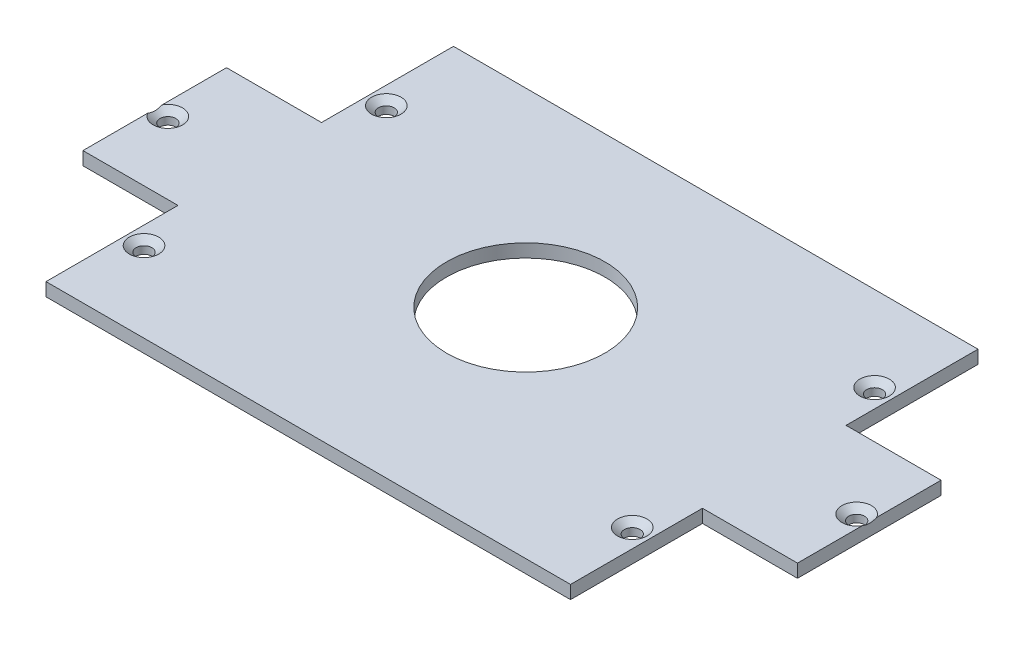
ISO-10303-21;
HEADER;
FILE_DESCRIPTION(('STEP AP214'),'2;1');
FILE_NAME('part.step','',(''),(''),'','','');
FILE_SCHEMA(('AUTOMOTIVE_DESIGN { 1 0 10303 214 1 1 1 1 }'));
ENDSEC;
DATA;
#1=APPLICATION_CONTEXT('core data for automotive mechanical design processes');
#2=APPLICATION_PROTOCOL_DEFINITION('international standard','automotive_design',2000,#1);
#3=PRODUCT_CONTEXT('',#1,'mechanical');
#4=PRODUCT('Part','Part','',(#3));
#5=PRODUCT_RELATED_PRODUCT_CATEGORY('part','',(#4));
#6=PRODUCT_DEFINITION_FORMATION('','',#4);
#7=PRODUCT_DEFINITION_CONTEXT('part definition',#1,'design');
#8=PRODUCT_DEFINITION('design','',#6,#7);
#9=PRODUCT_DEFINITION_SHAPE('','',#8);
#10=(LENGTH_UNIT() NAMED_UNIT(*) SI_UNIT(.MILLI.,.METRE.));
#11=(NAMED_UNIT(*) PLANE_ANGLE_UNIT() SI_UNIT($,.RADIAN.));
#12=(NAMED_UNIT(*) SI_UNIT($,.STERADIAN.) SOLID_ANGLE_UNIT());
#13=UNCERTAINTY_MEASURE_WITH_UNIT(LENGTH_MEASURE(1.E-05),#10,'distance_accuracy_value','');
#14=(GEOMETRIC_REPRESENTATION_CONTEXT(3) GLOBAL_UNCERTAINTY_ASSIGNED_CONTEXT((#13)) GLOBAL_UNIT_ASSIGNED_CONTEXT((#10,
#11,#12)) REPRESENTATION_CONTEXT('',''));
#15=CARTESIAN_POINT('',(0.,0.,0.));
#16=DIRECTION('',(0.,0.,1.));
#17=DIRECTION('',(1.,0.,0.));
#18=AXIS2_PLACEMENT_3D('',#15,#16,#17);
#19=CARTESIAN_POINT('',(0.,3.175,0.));
#20=DIRECTION('',(0.,-1.,0.));
#21=DIRECTION('',(0.,0.,-1.));
#22=AXIS2_PLACEMENT_3D('',#19,#20,#21);
#23=PLANE('',#22);
#24=CARTESIAN_POINT('',(-59.6133273346249,3.175,-37.2465531625836));
#25=DIRECTION('',(0.,1.,0.));
#26=DIRECTION('',(0.,0.,1.));
#27=AXIS2_PLACEMENT_3D('',#24,#25,#26);
#28=CIRCLE('',#27,3.5433);
#29=CARTESIAN_POINT('',(-59.6133273346249,3.175,-33.7032531625836));
#30=VERTEX_POINT('',#29);
#31=EDGE_CURVE('E364',#30,#30,#28,.T.);
#32=ORIENTED_EDGE('',*,*,#31,.F.);
#33=EDGE_LOOP('',(#32));
#34=FACE_BOUND('',#33,.T.);
#35=CARTESIAN_POINT('',(-59.6133273346249,3.175,21.0540531625834));
#36=DIRECTION('',(0.,1.,0.));
#37=DIRECTION('',(0.,0.,1.));
#38=AXIS2_PLACEMENT_3D('',#35,#36,#37);
#39=CIRCLE('',#38,3.5433);
#40=CARTESIAN_POINT('',(-59.6133273346249,3.175,24.5973531625834));
#41=VERTEX_POINT('',#40);
#42=EDGE_CURVE('E355',#41,#41,#39,.T.);
#43=ORIENTED_EDGE('',*,*,#42,.F.);
#44=EDGE_LOOP('',(#43));
#45=FACE_BOUND('',#44,.T.);
#46=CARTESIAN_POINT('',(57.8616726653751,3.175,21.0540531625834));
#47=DIRECTION('',(0.,1.,0.));
#48=DIRECTION('',(0.,0.,1.));
#49=AXIS2_PLACEMENT_3D('',#46,#47,#48);
#50=CIRCLE('',#49,3.5433);
#51=CARTESIAN_POINT('',(57.8616726653751,3.175,24.5973531625834));
#52=VERTEX_POINT('',#51);
#53=EDGE_CURVE('E346',#52,#52,#50,.T.);
#54=ORIENTED_EDGE('',*,*,#53,.F.);
#55=EDGE_LOOP('',(#54));
#56=FACE_BOUND('',#55,.T.);
#57=CARTESIAN_POINT('',(57.8616726653751,3.175,-37.2465531625836));
#58=DIRECTION('',(0.,1.,0.));
#59=DIRECTION('',(0.,0.,1.));
#60=AXIS2_PLACEMENT_3D('',#57,#58,#59);
#61=CIRCLE('',#60,3.5433);
#62=CARTESIAN_POINT('',(57.8616726653751,3.175,-33.7032531625836));
#63=VERTEX_POINT('',#62);
#64=EDGE_CURVE('E337',#63,#63,#61,.T.);
#65=ORIENTED_EDGE('',*,*,#64,.F.);
#66=EDGE_LOOP('',(#65));
#67=FACE_BOUND('',#66,.T.);
#68=DIRECTION('',(0.,0.,-1.));
#69=VECTOR('',#68,1.);
#70=CARTESIAN_POINT('',(85.166672665375,3.175,-25.9406776452774));
#71=LINE('',#70,#69);
#72=CARTESIAN_POINT('',(85.166672665375,3.175,8.60332235472264));
#73=VERTEX_POINT('',#72);
#74=CARTESIAN_POINT('',(85.166672665375,3.175,-7.00727762511277));
#75=VERTEX_POINT('',#74);
#76=EDGE_CURVE('E148',#73,#75,#71,.T.);
#77=ORIENTED_EDGE('',*,*,#76,.T.);
#78=CARTESIAN_POINT('',(82.071047665375,3.175,-8.73125000000011));
#79=DIRECTION('',(0.,1.,0.));
#80=DIRECTION('',(0.,0.,1.));
#81=AXIS2_PLACEMENT_3D('',#78,#79,#80);
#82=CIRCLE('',#81,3.5433);
#83=CARTESIAN_POINT('',(85.166672665375,3.175,-10.4552223748875));
#84=VERTEX_POINT('',#83);
#85=EDGE_CURVE('E56',#84,#75,#82,.T.);
#86=ORIENTED_EDGE('',*,*,#85,.F.);
#87=CARTESIAN_POINT('',(85.166672665375,3.175,-25.9406776452774));
#88=VERTEX_POINT('',#87);
#89=EDGE_CURVE('E146',#84,#88,#71,.T.);
#90=ORIENTED_EDGE('',*,*,#89,.T.);
#91=DIRECTION('',(-1.,0.,0.));
#92=VECTOR('',#91,1.);
#93=CARTESIAN_POINT('',(62.306672665375,3.175,-25.9406776452774));
#94=LINE('',#93,#92);
#95=CARTESIAN_POINT('',(62.306672665375,3.175,-25.9406776452774));
#96=VERTEX_POINT('',#95);
#97=EDGE_CURVE('E157',#88,#96,#94,.T.);
#98=ORIENTED_EDGE('',*,*,#97,.T.);
#99=DIRECTION('',(0.,0.,-1.));
#100=VECTOR('',#99,1.);
#101=CARTESIAN_POINT('',(62.306672665375,3.175,-57.6906776452773));
#102=LINE('',#101,#100);
#103=CARTESIAN_POINT('',(62.306672665375,3.175,-57.6906776452773));
#104=VERTEX_POINT('',#103);
#105=EDGE_CURVE('E163',#96,#104,#102,.T.);
#106=ORIENTED_EDGE('',*,*,#105,.T.);
#107=DIRECTION('',(-1.,0.,0.));
#108=VECTOR('',#107,1.);
#109=CARTESIAN_POINT('',(-63.899577334625,3.175,-57.6906776452773));
#110=LINE('',#109,#108);
#111=CARTESIAN_POINT('',(-63.899577334625,3.175,-57.6906776452773));
#112=VERTEX_POINT('',#111);
#113=EDGE_CURVE('E165',#104,#112,#110,.T.);
#114=ORIENTED_EDGE('',*,*,#113,.T.);
#115=DIRECTION('',(0.,0.,1.));
#116=VECTOR('',#115,1.);
#117=CARTESIAN_POINT('',(-63.899577334625,3.175,-57.6906776452773));
#118=LINE('',#117,#116);
#119=CARTESIAN_POINT('',(-63.8995773346249,3.175,-25.9406776452773));
#120=VERTEX_POINT('',#119);
#121=EDGE_CURVE('E167',#112,#120,#118,.T.);
#122=ORIENTED_EDGE('',*,*,#121,.T.);
#123=DIRECTION('',(-1.,0.,0.));
#124=VECTOR('',#123,1.);
#125=CARTESIAN_POINT('',(-63.8995773346249,3.175,-25.9406776452773));
#126=LINE('',#125,#124);
#127=CARTESIAN_POINT('',(-86.7595773346249,3.175,-25.9406776452773));
#128=VERTEX_POINT('',#127);
#129=EDGE_CURVE('E169',#120,#128,#126,.T.);
#130=ORIENTED_EDGE('',*,*,#129,.T.);
#131=DIRECTION('',(0.,0.,1.));
#132=VECTOR('',#131,1.);
#133=CARTESIAN_POINT('',(-86.7595773346249,3.175,8.60332235472266));
#134=LINE('',#133,#132);
#135=CARTESIAN_POINT('',(-86.7595773346249,3.175,-10.4552223748874));
#136=VERTEX_POINT('',#135);
#137=EDGE_CURVE('E172',#128,#136,#134,.T.);
#138=ORIENTED_EDGE('',*,*,#137,.T.);
#139=CARTESIAN_POINT('',(-83.6639523346249,3.175,-8.73125000000011));
#140=DIRECTION('',(0.,1.,0.));
#141=DIRECTION('',(0.,0.,1.));
#142=AXIS2_PLACEMENT_3D('',#139,#140,#141);
#143=CIRCLE('',#142,3.5433);
#144=CARTESIAN_POINT('',(-86.7595773346249,3.175,-7.00727762511279));
#145=VERTEX_POINT('',#144);
#146=EDGE_CURVE('E62',#145,#136,#143,.T.);
#147=ORIENTED_EDGE('',*,*,#146,.F.);
#148=CARTESIAN_POINT('',(-86.7595773346249,3.175,8.60332235472266));
#149=VERTEX_POINT('',#148);
#150=EDGE_CURVE('E171',#145,#149,#134,.T.);
#151=ORIENTED_EDGE('',*,*,#150,.T.);
#152=DIRECTION('',(1.,0.,0.));
#153=VECTOR('',#152,1.);
#154=CARTESIAN_POINT('',(-63.8995773346249,3.175,8.60332235472266));
#155=LINE('',#154,#153);
#156=CARTESIAN_POINT('',(-63.8995773346249,3.175,8.60332235472266));
#157=VERTEX_POINT('',#156);
#158=EDGE_CURVE('E175',#149,#157,#155,.T.);
#159=ORIENTED_EDGE('',*,*,#158,.T.);
#160=DIRECTION('',(0.,0.,1.));
#161=VECTOR('',#160,1.);
#162=CARTESIAN_POINT('',(-63.8995773346249,3.175,8.60332235472266));
#163=LINE('',#162,#161);
#164=CARTESIAN_POINT('',(-63.8995773346249,3.175,40.3533223547227));
#165=VERTEX_POINT('',#164);
#166=EDGE_CURVE('E177',#157,#165,#163,.T.);
#167=ORIENTED_EDGE('',*,*,#166,.T.);
#168=DIRECTION('',(1.,0.,0.));
#169=VECTOR('',#168,1.);
#170=CARTESIAN_POINT('',(62.306672665375,3.175,40.3533223547226));
#171=LINE('',#170,#169);
#172=CARTESIAN_POINT('',(62.306672665375,3.175,40.3533223547226));
#173=VERTEX_POINT('',#172);
#174=EDGE_CURVE('E179',#165,#173,#171,.T.);
#175=ORIENTED_EDGE('',*,*,#174,.T.);
#176=DIRECTION('',(0.,0.,-1.));
#177=VECTOR('',#176,1.);
#178=CARTESIAN_POINT('',(62.306672665375,3.175,8.60332235472264));
#179=LINE('',#178,#177);
#180=CARTESIAN_POINT('',(62.306672665375,3.175,8.60332235472264));
#181=VERTEX_POINT('',#180);
#182=EDGE_CURVE('E158',#173,#181,#179,.T.);
#183=ORIENTED_EDGE('',*,*,#182,.T.);
#184=DIRECTION('',(1.,0.,0.));
#185=VECTOR('',#184,1.);
#186=CARTESIAN_POINT('',(62.306672665375,3.175,8.60332235472264));
#187=LINE('',#186,#185);
#188=EDGE_CURVE('E155',#181,#73,#187,.T.);
#189=ORIENTED_EDGE('',*,*,#188,.T.);
#190=EDGE_LOOP('',(#77,#86,#90,#98,#106,#114,#122,#130,#138,#147,#151,#159,#167,#175,#183,#189));
#191=FACE_BOUND('',#190,.T.);
#192=CARTESIAN_POINT('',(-0.796452334624956,3.175,-11.9706776452773));
#193=DIRECTION('',(0.,1.,0.));
#194=DIRECTION('',(0.,0.,1.));
#195=AXIS2_PLACEMENT_3D('',#192,#193,#194);
#196=CIRCLE('',#195,19.05);
#197=CARTESIAN_POINT('',(-0.796452334624956,3.175,7.07932235472266));
#198=VERTEX_POINT('',#197);
#199=EDGE_CURVE('E186',#198,#198,#196,.T.);
#200=ORIENTED_EDGE('',*,*,#199,.F.);
#201=EDGE_LOOP('',(#200));
#202=FACE_BOUND('',#201,.T.);
#203=ADVANCED_FACE('F37',(#34,#45,#56,#67,#191,#202),#23,.F.);
#204=CARTESIAN_POINT('',(0.,0.,0.));
#205=DIRECTION('',(0.,-1.,0.));
#206=DIRECTION('',(0.,0.,-1.));
#207=AXIS2_PLACEMENT_3D('',#204,#205,#206);
#208=PLANE('',#207);
#209=CARTESIAN_POINT('',(82.071047665375,0.,-8.73125000000011));
#210=DIRECTION('',(0.,1.,0.));
#211=DIRECTION('',(0.,0.,1.));
#212=AXIS2_PLACEMENT_3D('',#209,#210,#211);
#213=CIRCLE('',#212,1.89865);
#214=CARTESIAN_POINT('',(82.071047665375,0.,-6.83260000000011));
#215=VERTEX_POINT('',#214);
#216=EDGE_CURVE('E374',#215,#215,#213,.T.);
#217=ORIENTED_EDGE('',*,*,#216,.T.);
#218=EDGE_LOOP('',(#217));
#219=FACE_BOUND('',#218,.T.);
#220=CARTESIAN_POINT('',(-83.6639523346249,0.,-8.73125000000011));
#221=DIRECTION('',(0.,1.,0.));
#222=DIRECTION('',(0.,0.,1.));
#223=AXIS2_PLACEMENT_3D('',#220,#221,#222);
#224=CIRCLE('',#223,1.89865);
#225=CARTESIAN_POINT('',(-83.6639523346249,0.,-6.83260000000011));
#226=VERTEX_POINT('',#225);
#227=EDGE_CURVE('E367',#226,#226,#224,.T.);
#228=ORIENTED_EDGE('',*,*,#227,.T.);
#229=EDGE_LOOP('',(#228));
#230=FACE_BOUND('',#229,.T.);
#231=CARTESIAN_POINT('',(-59.6133273346249,0.,-37.2465531625836));
#232=DIRECTION('',(0.,1.,0.));
#233=DIRECTION('',(0.,0.,1.));
#234=AXIS2_PLACEMENT_3D('',#231,#232,#233);
#235=CIRCLE('',#234,1.89865);
#236=CARTESIAN_POINT('',(-59.6133273346249,0.,-35.3479031625836));
#237=VERTEX_POINT('',#236);
#238=EDGE_CURVE('E358',#237,#237,#235,.T.);
#239=ORIENTED_EDGE('',*,*,#238,.T.);
#240=EDGE_LOOP('',(#239));
#241=FACE_BOUND('',#240,.T.);
#242=CARTESIAN_POINT('',(-59.6133273346249,0.,21.0540531625834));
#243=DIRECTION('',(0.,1.,0.));
#244=DIRECTION('',(0.,0.,1.));
#245=AXIS2_PLACEMENT_3D('',#242,#243,#244);
#246=CIRCLE('',#245,1.89865);
#247=CARTESIAN_POINT('',(-59.6133273346249,0.,22.9527031625834));
#248=VERTEX_POINT('',#247);
#249=EDGE_CURVE('E349',#248,#248,#246,.T.);
#250=ORIENTED_EDGE('',*,*,#249,.T.);
#251=EDGE_LOOP('',(#250));
#252=FACE_BOUND('',#251,.T.);
#253=CARTESIAN_POINT('',(57.8616726653751,0.,21.0540531625834));
#254=DIRECTION('',(0.,1.,0.));
#255=DIRECTION('',(0.,0.,1.));
#256=AXIS2_PLACEMENT_3D('',#253,#254,#255);
#257=CIRCLE('',#256,1.89865);
#258=CARTESIAN_POINT('',(57.8616726653751,0.,22.9527031625834));
#259=VERTEX_POINT('',#258);
#260=EDGE_CURVE('E340',#259,#259,#257,.T.);
#261=ORIENTED_EDGE('',*,*,#260,.T.);
#262=EDGE_LOOP('',(#261));
#263=FACE_BOUND('',#262,.T.);
#264=CARTESIAN_POINT('',(57.8616726653751,0.,-37.2465531625836));
#265=DIRECTION('',(0.,1.,0.));
#266=DIRECTION('',(0.,0.,1.));
#267=AXIS2_PLACEMENT_3D('',#264,#265,#266);
#268=CIRCLE('',#267,1.89865);
#269=CARTESIAN_POINT('',(57.8616726653751,0.,-35.3479031625836));
#270=VERTEX_POINT('',#269);
#271=EDGE_CURVE('E329',#270,#270,#268,.T.);
#272=ORIENTED_EDGE('',*,*,#271,.T.);
#273=EDGE_LOOP('',(#272));
#274=FACE_BOUND('',#273,.T.);
#275=DIRECTION('',(0.,0.,-1.));
#276=VECTOR('',#275,1.);
#277=CARTESIAN_POINT('',(62.306672665375,0.,8.60332235472264));
#278=LINE('',#277,#276);
#279=CARTESIAN_POINT('',(62.306672665375,0.,40.3533223547226));
#280=VERTEX_POINT('',#279);
#281=CARTESIAN_POINT('',(62.306672665375,0.,8.60332235472264));
#282=VERTEX_POINT('',#281);
#283=EDGE_CURVE('E182',#280,#282,#278,.T.);
#284=ORIENTED_EDGE('',*,*,#283,.F.);
#285=DIRECTION('',(1.,0.,0.));
#286=VECTOR('',#285,1.);
#287=CARTESIAN_POINT('',(62.306672665375,0.,40.3533223547226));
#288=LINE('',#287,#286);
#289=CARTESIAN_POINT('',(-63.8995773346249,0.,40.3533223547227));
#290=VERTEX_POINT('',#289);
#291=EDGE_CURVE('E206',#290,#280,#288,.T.);
#292=ORIENTED_EDGE('',*,*,#291,.F.);
#293=DIRECTION('',(0.,0.,1.));
#294=VECTOR('',#293,1.);
#295=CARTESIAN_POINT('',(-63.8995773346249,0.,8.60332235472266));
#296=LINE('',#295,#294);
#297=CARTESIAN_POINT('',(-63.8995773346249,0.,8.60332235472266));
#298=VERTEX_POINT('',#297);
#299=EDGE_CURVE('E204',#298,#290,#296,.T.);
#300=ORIENTED_EDGE('',*,*,#299,.F.);
#301=DIRECTION('',(1.,0.,0.));
#302=VECTOR('',#301,1.);
#303=CARTESIAN_POINT('',(-63.8995773346249,0.,8.60332235472266));
#304=LINE('',#303,#302);
#305=CARTESIAN_POINT('',(-86.7595773346249,0.,8.60332235472266));
#306=VERTEX_POINT('',#305);
#307=EDGE_CURVE('E202',#306,#298,#304,.T.);
#308=ORIENTED_EDGE('',*,*,#307,.F.);
#309=DIRECTION('',(0.,0.,1.));
#310=VECTOR('',#309,1.);
#311=CARTESIAN_POINT('',(-86.7595773346249,0.,8.60332235472266));
#312=LINE('',#311,#310);
#313=CARTESIAN_POINT('',(-86.7595773346249,0.,-25.9406776452773));
#314=VERTEX_POINT('',#313);
#315=EDGE_CURVE('E200',#314,#306,#312,.T.);
#316=ORIENTED_EDGE('',*,*,#315,.F.);
#317=DIRECTION('',(-1.,0.,0.));
#318=VECTOR('',#317,1.);
#319=CARTESIAN_POINT('',(-63.8995773346249,0.,-25.9406776452773));
#320=LINE('',#319,#318);
#321=CARTESIAN_POINT('',(-63.8995773346249,0.,-25.9406776452773));
#322=VERTEX_POINT('',#321);
#323=EDGE_CURVE('E198',#322,#314,#320,.T.);
#324=ORIENTED_EDGE('',*,*,#323,.F.);
#325=DIRECTION('',(0.,0.,1.));
#326=VECTOR('',#325,1.);
#327=CARTESIAN_POINT('',(-63.899577334625,0.,-57.6906776452773));
#328=LINE('',#327,#326);
#329=CARTESIAN_POINT('',(-63.899577334625,0.,-57.6906776452773));
#330=VERTEX_POINT('',#329);
#331=EDGE_CURVE('E196',#330,#322,#328,.T.);
#332=ORIENTED_EDGE('',*,*,#331,.F.);
#333=DIRECTION('',(-1.,0.,0.));
#334=VECTOR('',#333,1.);
#335=CARTESIAN_POINT('',(-63.899577334625,0.,-57.6906776452773));
#336=LINE('',#335,#334);
#337=CARTESIAN_POINT('',(62.306672665375,0.,-57.6906776452773));
#338=VERTEX_POINT('',#337);
#339=EDGE_CURVE('E194',#338,#330,#336,.T.);
#340=ORIENTED_EDGE('',*,*,#339,.F.);
#341=DIRECTION('',(0.,0.,-1.));
#342=VECTOR('',#341,1.);
#343=CARTESIAN_POINT('',(62.306672665375,0.,-57.6906776452773));
#344=LINE('',#343,#342);
#345=CARTESIAN_POINT('',(62.306672665375,0.,-25.9406776452774));
#346=VERTEX_POINT('',#345);
#347=EDGE_CURVE('E192',#346,#338,#344,.T.);
#348=ORIENTED_EDGE('',*,*,#347,.F.);
#349=DIRECTION('',(-1.,0.,0.));
#350=VECTOR('',#349,1.);
#351=CARTESIAN_POINT('',(62.306672665375,0.,-25.9406776452774));
#352=LINE('',#351,#350);
#353=CARTESIAN_POINT('',(85.166672665375,0.,-25.9406776452774));
#354=VERTEX_POINT('',#353);
#355=EDGE_CURVE('E190',#354,#346,#352,.T.);
#356=ORIENTED_EDGE('',*,*,#355,.F.);
#357=DIRECTION('',(0.,0.,-1.));
#358=VECTOR('',#357,1.);
#359=CARTESIAN_POINT('',(85.166672665375,0.,-25.9406776452774));
#360=LINE('',#359,#358);
#361=CARTESIAN_POINT('',(85.166672665375,0.,8.60332235472264));
#362=VERTEX_POINT('',#361);
#363=EDGE_CURVE('E188',#362,#354,#360,.T.);
#364=ORIENTED_EDGE('',*,*,#363,.F.);
#365=DIRECTION('',(1.,0.,0.));
#366=VECTOR('',#365,1.);
#367=CARTESIAN_POINT('',(62.306672665375,0.,8.60332235472264));
#368=LINE('',#367,#366);
#369=EDGE_CURVE('E185',#282,#362,#368,.T.);
#370=ORIENTED_EDGE('',*,*,#369,.F.);
#371=EDGE_LOOP('',(#284,#292,#300,#308,#316,#324,#332,#340,#348,#356,#364,#370));
#372=FACE_BOUND('',#371,.T.);
#373=CARTESIAN_POINT('',(-0.796452334624956,0.,-11.9706776452773));
#374=DIRECTION('',(0.,1.,0.));
#375=DIRECTION('',(0.,0.,1.));
#376=AXIS2_PLACEMENT_3D('',#373,#374,#375);
#377=CIRCLE('',#376,19.05);
#378=CARTESIAN_POINT('',(-0.796452334624956,0.,7.07932235472266));
#379=VERTEX_POINT('',#378);
#380=EDGE_CURVE('E326',#379,#379,#377,.T.);
#381=ORIENTED_EDGE('',*,*,#380,.T.);
#382=EDGE_LOOP('',(#381));
#383=FACE_BOUND('',#382,.T.);
#384=ADVANCED_FACE('F284',(#219,#230,#241,#252,#263,#274,#372,#383),#208,.T.);
#385=CARTESIAN_POINT('',(62.306672665375,3.175,8.60332235472264));
#386=DIRECTION('',(-1.,0.,0.));
#387=DIRECTION('',(0.,0.,1.));
#388=AXIS2_PLACEMENT_3D('',#385,#386,#387);
#389=PLANE('',#388);
#390=ORIENTED_EDGE('',*,*,#283,.T.);
#391=DIRECTION('',(0.,-1.,0.));
#392=VECTOR('',#391,1.);
#393=CARTESIAN_POINT('',(62.306672665375,3.175,8.60332235472264));
#394=LINE('',#393,#392);
#395=EDGE_CURVE('E238',#181,#282,#394,.T.);
#396=ORIENTED_EDGE('',*,*,#395,.F.);
#397=ORIENTED_EDGE('',*,*,#182,.F.);
#398=DIRECTION('',(0.,-1.,0.));
#399=VECTOR('',#398,1.);
#400=CARTESIAN_POINT('',(62.306672665375,3.175,40.3533223547226));
#401=LINE('',#400,#399);
#402=EDGE_CURVE('E181',#173,#280,#401,.T.);
#403=ORIENTED_EDGE('',*,*,#402,.T.);
#404=EDGE_LOOP('',(#390,#396,#397,#403));
#405=FACE_BOUND('',#404,.T.);
#406=ADVANCED_FACE('F39',(#405),#389,.F.);
#407=CARTESIAN_POINT('',(62.306672665375,3.175,8.60332235472264));
#408=DIRECTION('',(0.,0.,-1.));
#409=DIRECTION('',(-1.,0.,0.));
#410=AXIS2_PLACEMENT_3D('',#407,#408,#409);
#411=PLANE('',#410);
#412=ORIENTED_EDGE('',*,*,#369,.T.);
#413=DIRECTION('',(0.,-1.,0.));
#414=VECTOR('',#413,1.);
#415=CARTESIAN_POINT('',(85.166672665375,3.175,8.60332235472264));
#416=LINE('',#415,#414);
#417=EDGE_CURVE('E235',#73,#362,#416,.T.);
#418=ORIENTED_EDGE('',*,*,#417,.F.);
#419=ORIENTED_EDGE('',*,*,#188,.F.);
#420=ORIENTED_EDGE('',*,*,#395,.T.);
#421=EDGE_LOOP('',(#412,#418,#419,#420));
#422=FACE_BOUND('',#421,.T.);
#423=ADVANCED_FACE('F278',(#422),#411,.F.);
#424=CARTESIAN_POINT('',(85.166672665375,3.175,-25.9406776452774));
#425=DIRECTION('',(-1.,0.,0.));
#426=DIRECTION('',(0.,0.,1.));
#427=AXIS2_PLACEMENT_3D('',#424,#425,#426);
#428=PLANE('',#427);
#429=ORIENTED_EDGE('',*,*,#89,.F.);
#430=CARTESIAN_POINT('',(85.166672665375,12.4441013809417,-22.9888419578755));
#431=CARTESIAN_POINT('',(85.166672665375,12.1344069225908,-22.6111374524505));
#432=CARTESIAN_POINT('',(85.166672665375,11.8250193551598,-22.2331804275082));
#433=CARTESIAN_POINT('',(85.166672665375,11.2064859423441,-21.4758258624886));
#434=CARTESIAN_POINT('',(85.166672665375,10.8973417759305,-21.0964269514799));
#435=CARTESIAN_POINT('',(85.166672665375,10.2686857273399,-20.3226347207685));
#436=CARTESIAN_POINT('',(85.166672665375,9.949215174756,-19.9282078013378));
#437=CARTESIAN_POINT('',(85.166672665375,9.31249995827895,-19.1388593118911));
#438=CARTESIAN_POINT('',(85.166672665375,8.99525212375669,-18.7439403017572));
#439=CARTESIAN_POINT('',(85.166672665375,8.40910125375085,-18.0100940583258));
#440=CARTESIAN_POINT('',(85.166672665375,8.13989919632548,-17.6714059185251));
#441=CARTESIAN_POINT('',(85.166672665375,7.60371614457835,-16.9922784999227));
#442=CARTESIAN_POINT('',(85.166672665375,7.33673513415723,-16.651839233843));
#443=CARTESIAN_POINT('',(85.166672665375,6.80382407288671,-15.9658232235261));
#444=CARTESIAN_POINT('',(85.166672665375,6.53791883270384,-15.6202271332418));
#445=CARTESIAN_POINT('',(85.166672665375,6.14276897651769,-15.0992217402923));
#446=CARTESIAN_POINT('',(85.166672665375,6.0117181573374,-14.9251829363721));
#447=CARTESIAN_POINT('',(85.166672665375,5.75113432517866,-14.575973706688));
#448=CARTESIAN_POINT('',(85.166672665375,5.62160129688307,-14.4008032923716));
#449=CARTESIAN_POINT('',(85.166672665375,5.36861351116803,-14.0547327676045));
#450=CARTESIAN_POINT('',(85.166672665375,5.24509756077272,-13.8838774634474));
#451=CARTESIAN_POINT('',(85.166672665375,5.00038053603806,-13.5405017635887));
#452=CARTESIAN_POINT('',(85.166672665375,4.87917956282986,-13.3679812956367));
#453=CARTESIAN_POINT('',(85.166672665375,4.63945435897496,-13.0202969842359));
#454=CARTESIAN_POINT('',(85.166672665375,4.52093955115432,-12.8451266225541));
#455=CARTESIAN_POINT('',(85.166672665375,4.28804916360398,-12.4920726630241));
#456=CARTESIAN_POINT('',(85.166672665375,4.17367306811354,-12.3141894072076));
#457=CARTESIAN_POINT('',(85.166672665375,3.95226790314328,-11.9575089010827));
#458=CARTESIAN_POINT('',(85.166672665375,3.84515537813969,-11.7787637877131));
#459=CARTESIAN_POINT('',(85.166672665375,3.63869604544494,-11.4166324324804));
#460=CARTESIAN_POINT('',(85.166672665375,3.53935426409936,-11.233243286579));
#461=CARTESIAN_POINT('',(85.166672665375,3.35258543283551,-10.8616793195566));
#462=CARTESIAN_POINT('',(85.166672665375,3.26509645393138,-10.6735359926622));
#463=CARTESIAN_POINT('',(85.166672665375,3.1068711810344,-10.2904013306374));
#464=CARTESIAN_POINT('',(85.166672665375,3.0361057059583,-10.0954226158903));
#465=CARTESIAN_POINT('',(85.166672665375,2.968857509656,-9.8679972621255));
#466=CARTESIAN_POINT('',(85.166672665375,2.96055678979797,-9.83898255526487));
#467=CARTESIAN_POINT('',(85.166672665375,2.94449215811897,-9.78079816054297));
#468=CARTESIAN_POINT('',(85.166672665375,2.93672835578111,-9.75162844237143));
#469=CARTESIAN_POINT('',(85.166672665375,2.91427494712465,-9.66387192915063));
#470=CARTESIAN_POINT('',(85.166672665375,2.90043161975613,-9.60506562057361));
#471=CARTESIAN_POINT('',(85.166672665375,2.87520444369178,-9.48694479695281));
#472=CARTESIAN_POINT('',(85.166672665375,2.86381987445963,-9.42763043610497));
#473=CARTESIAN_POINT('',(85.166672665375,2.84368729634553,-9.30855987310553));
#474=CARTESIAN_POINT('',(85.166672665375,2.83493901244329,-9.24880371770924));
#475=CARTESIAN_POINT('',(85.166672665375,2.82042753039214,-9.13054084086418));
#476=CARTESIAN_POINT('',(85.166672665375,2.81459110820736,-9.07204317372587));
#477=CARTESIAN_POINT('',(85.166672665375,2.80566166891058,-8.95484296844305));
#478=CARTESIAN_POINT('',(85.166672665375,2.80256864205944,-8.89614043102657));
#479=CARTESIAN_POINT('',(85.166672665375,2.7975088794536,-8.71984640248073));
#480=CARTESIAN_POINT('',(85.166672665375,2.79976579141101,-8.60210315534931));
#481=CARTESIAN_POINT('',(85.166672665375,2.81503486248295,-8.37273954884055));
#482=CARTESIAN_POINT('',(85.166672665375,2.82755274338696,-8.26108445750502));
#483=CARTESIAN_POINT('',(85.166672665375,2.8618901654608,-8.03926425648809));
#484=CARTESIAN_POINT('',(85.166672665375,2.8837074491308,-7.92909879188078));
#485=CARTESIAN_POINT('',(85.166672665375,2.93603211343008,-7.70827983970367));
#486=CARTESIAN_POINT('',(85.166672665375,2.96672231966729,-7.59767018803758));
#487=CARTESIAN_POINT('',(85.166672665375,3.01806661513988,-7.43345814957781));
#488=CARTESIAN_POINT('',(85.166672665375,3.03606644572271,-7.37900393492823));
#489=CARTESIAN_POINT('',(85.166672665375,3.07367274001274,-7.27065541094367));
#490=CARTESIAN_POINT('',(85.166672665375,3.09327912499906,-7.2167610743204));
#491=CARTESIAN_POINT('',(85.166672665375,3.15736710709347,-7.04773777047434));
#492=CARTESIAN_POINT('',(85.166672665375,3.20448106440411,-6.93360283507127));
#493=CARTESIAN_POINT('',(85.166672665375,3.30405005547473,-6.70767214143206));
#494=CARTESIAN_POINT('',(85.166672665375,3.35650694112979,-6.5958772105534));
#495=CARTESIAN_POINT('',(85.166672665375,3.46572549728184,-6.37423925464753));
#496=CARTESIAN_POINT('',(85.166672665375,3.52249270995121,-6.2643989746579));
#497=CARTESIAN_POINT('',(85.166672665375,3.63940997817159,-6.04656077972844));
#498=CARTESIAN_POINT('',(85.166672665375,3.69955965976789,-5.938562662839));
#499=CARTESIAN_POINT('',(85.166672665375,3.88485229505338,-5.61552568786059));
#500=CARTESIAN_POINT('',(85.166672665375,4.01412096151319,-5.40285673621412));
#501=CARTESIAN_POINT('',(85.166672665375,4.27976737429295,-4.98226598609358));
#502=CARTESIAN_POINT('',(85.166672665375,4.41614046359028,-4.77434120318701));
#503=CARTESIAN_POINT('',(85.166672665375,4.6782543604568,-4.38508141032023));
#504=CARTESIAN_POINT('',(85.166672665375,4.80346438060435,-4.20338755299008));
#505=CARTESIAN_POINT('',(85.166672665375,5.05683210985579,-3.84202616834274));
#506=CARTESIAN_POINT('',(85.166672665375,5.18499032977218,-3.66235900033513));
#507=CARTESIAN_POINT('',(85.166672665375,5.44176727976443,-3.30706400038243));
#508=CARTESIAN_POINT('',(85.166672665375,5.57035605439313,-3.13141446220855));
#509=CARTESIAN_POINT('',(85.166672665375,5.82920719274321,-2.78142563373584));
#510=CARTESIAN_POINT('',(85.166672665375,5.95946909230542,-2.60708600044237));
#511=CARTESIAN_POINT('',(85.166672665375,6.09036033939567,-2.43322689342186));
#512=B_SPLINE_CURVE_WITH_KNOTS('',3,(#430,#431,#432,#433,#434,#435,#436,#437,#438,#439,#440,
#441,#442,#443,#444,#445,#446,#447,#448,#449,#450,#451,#452,#453,#454,#455,#456,#457,#458,#459,
#460,#461,#462,#463,#464,#465,#466,#467,#468,#469,#470,#471,#472,#473,#474,#475,#476,#477,#478,
#479,#480,#481,#482,#483,#484,#485,#486,#487,#488,#489,#490,#491,#492,#493,#494,#495,#496,#497,
#498,#499,#500,#501,#502,#503,#504,#505,#506,#507,#508,#509,#510,#511),.UNSPECIFIED.,.F.,.F.,(4,
2,2,2,2,2,2,2,2,2,2,2,2,2,2,2,2,2,2,2,2,2,2,2,2,2,2,2,2,2,2,2,2,2,2,2,2,2,2,2,4),(0.,
1.46531385846888,2.93351646770488,4.45624338890572,5.97593009625948,7.27385020238527,
8.57176089226489,9.87988703821156,10.533466691093,11.1870397425332,11.8195039088595,
12.4519956418514,13.086440750023,13.7208065202873,14.3458200505891,14.9712345712577,
15.5932437929473,16.2141595128383,16.3046922195272,16.3952433326823,16.5764326531449,
16.7575688040155,16.9386860520085,17.1149848127413,17.2912829476051,17.6439835803441,
17.9806285440521,18.317191831171,18.6612555062975,18.8332912487484,19.005318566514,
19.3755567074389,19.7459236149445,20.116775074378,20.4875856139866,21.2339537519637,
21.9798386476791,22.6417762696732,23.3038294575555,23.9568806742279,24.6097544746858),.UNSPECIFIED.);
#513=EDGE_CURVE('E11',#84,#75,#512,.T.);
#514=ORIENTED_EDGE('',*,*,#513,.T.);
#515=ORIENTED_EDGE('',*,*,#76,.F.);
#516=ORIENTED_EDGE('',*,*,#417,.T.);
#517=ORIENTED_EDGE('',*,*,#363,.T.);
#518=DIRECTION('',(0.,-1.,0.));
#519=VECTOR('',#518,1.);
#520=CARTESIAN_POINT('',(85.166672665375,3.175,-25.9406776452774));
#521=LINE('',#520,#519);
#522=EDGE_CURVE('E153',#88,#354,#521,.T.);
#523=ORIENTED_EDGE('',*,*,#522,.F.);
#524=EDGE_LOOP('',(#429,#514,#515,#516,#517,#523));
#525=FACE_BOUND('',#524,.T.);
#526=ADVANCED_FACE('F151',(#525),#428,.F.);
#527=CARTESIAN_POINT('',(62.306672665375,3.175,-25.9406776452774));
#528=DIRECTION('',(0.,0.,1.));
#529=DIRECTION('',(1.,0.,0.));
#530=AXIS2_PLACEMENT_3D('',#527,#528,#529);
#531=PLANE('',#530);
#532=ORIENTED_EDGE('',*,*,#355,.T.);
#533=DIRECTION('',(0.,-1.,0.));
#534=VECTOR('',#533,1.);
#535=CARTESIAN_POINT('',(62.306672665375,3.175,-25.9406776452774));
#536=LINE('',#535,#534);
#537=EDGE_CURVE('E231',#96,#346,#536,.T.);
#538=ORIENTED_EDGE('',*,*,#537,.F.);
#539=ORIENTED_EDGE('',*,*,#97,.F.);
#540=ORIENTED_EDGE('',*,*,#522,.T.);
#541=EDGE_LOOP('',(#532,#538,#539,#540));
#542=FACE_BOUND('',#541,.T.);
#543=ADVANCED_FACE('F272',(#542),#531,.F.);
#544=CARTESIAN_POINT('',(62.306672665375,3.175,-57.6906776452773));
#545=DIRECTION('',(-1.,0.,0.));
#546=DIRECTION('',(0.,0.,1.));
#547=AXIS2_PLACEMENT_3D('',#544,#545,#546);
#548=PLANE('',#547);
#549=ORIENTED_EDGE('',*,*,#347,.T.);
#550=DIRECTION('',(0.,-1.,0.));
#551=VECTOR('',#550,1.);
#552=CARTESIAN_POINT('',(62.306672665375,3.175,-57.6906776452773));
#553=LINE('',#552,#551);
#554=EDGE_CURVE('E228',#104,#338,#553,.T.);
#555=ORIENTED_EDGE('',*,*,#554,.F.);
#556=ORIENTED_EDGE('',*,*,#105,.F.);
#557=ORIENTED_EDGE('',*,*,#537,.T.);
#558=EDGE_LOOP('',(#549,#555,#556,#557));
#559=FACE_BOUND('',#558,.T.);
#560=ADVANCED_FACE('F268',(#559),#548,.F.);
#561=CARTESIAN_POINT('',(-63.899577334625,3.175,-57.6906776452773));
#562=DIRECTION('',(0.,0.,1.));
#563=DIRECTION('',(1.,0.,0.));
#564=AXIS2_PLACEMENT_3D('',#561,#562,#563);
#565=PLANE('',#564);
#566=ORIENTED_EDGE('',*,*,#339,.T.);
#567=DIRECTION('',(0.,-1.,0.));
#568=VECTOR('',#567,1.);
#569=CARTESIAN_POINT('',(-63.899577334625,3.175,-57.6906776452773));
#570=LINE('',#569,#568);
#571=EDGE_CURVE('E225',#112,#330,#570,.T.);
#572=ORIENTED_EDGE('',*,*,#571,.F.);
#573=ORIENTED_EDGE('',*,*,#113,.F.);
#574=ORIENTED_EDGE('',*,*,#554,.T.);
#575=EDGE_LOOP('',(#566,#572,#573,#574));
#576=FACE_BOUND('',#575,.T.);
#577=ADVANCED_FACE('F264',(#576),#565,.F.);
#578=CARTESIAN_POINT('',(-63.899577334625,3.175,-57.6906776452773));
#579=DIRECTION('',(1.,0.,0.));
#580=DIRECTION('',(0.,0.,-1.));
#581=AXIS2_PLACEMENT_3D('',#578,#579,#580);
#582=PLANE('',#581);
#583=ORIENTED_EDGE('',*,*,#331,.T.);
#584=DIRECTION('',(0.,-1.,0.));
#585=VECTOR('',#584,1.);
#586=CARTESIAN_POINT('',(-63.8995773346249,3.175,-25.9406776452773));
#587=LINE('',#586,#585);
#588=EDGE_CURVE('E222',#120,#322,#587,.T.);
#589=ORIENTED_EDGE('',*,*,#588,.F.);
#590=ORIENTED_EDGE('',*,*,#121,.F.);
#591=ORIENTED_EDGE('',*,*,#571,.T.);
#592=EDGE_LOOP('',(#583,#589,#590,#591));
#593=FACE_BOUND('',#592,.T.);
#594=ADVANCED_FACE('F260',(#593),#582,.F.);
#595=CARTESIAN_POINT('',(-63.8995773346249,3.175,-25.9406776452773));
#596=DIRECTION('',(0.,0.,1.));
#597=DIRECTION('',(1.,0.,0.));
#598=AXIS2_PLACEMENT_3D('',#595,#596,#597);
#599=PLANE('',#598);
#600=ORIENTED_EDGE('',*,*,#323,.T.);
#601=DIRECTION('',(0.,-1.,0.));
#602=VECTOR('',#601,1.);
#603=CARTESIAN_POINT('',(-86.7595773346249,3.175,-25.9406776452773));
#604=LINE('',#603,#602);
#605=EDGE_CURVE('E219',#128,#314,#604,.T.);
#606=ORIENTED_EDGE('',*,*,#605,.F.);
#607=ORIENTED_EDGE('',*,*,#129,.F.);
#608=ORIENTED_EDGE('',*,*,#588,.T.);
#609=EDGE_LOOP('',(#600,#606,#607,#608));
#610=FACE_BOUND('',#609,.T.);
#611=ADVANCED_FACE('F255',(#610),#599,.F.);
#612=CARTESIAN_POINT('',(-86.7595773346249,3.175,8.60332235472266));
#613=DIRECTION('',(1.,0.,0.));
#614=DIRECTION('',(0.,0.,-1.));
#615=AXIS2_PLACEMENT_3D('',#612,#613,#614);
#616=PLANE('',#615);
#617=ORIENTED_EDGE('',*,*,#150,.F.);
#618=CARTESIAN_POINT('',(-86.7595773346249,12.4441013809417,-22.9888419578755));
#619=CARTESIAN_POINT('',(-86.7595773346249,12.1344069225908,-22.6111374524505));
#620=CARTESIAN_POINT('',(-86.7595773346249,11.8250193551598,-22.2331804275082));
#621=CARTESIAN_POINT('',(-86.7595773346249,11.2064859423441,-21.4758258624886));
#622=CARTESIAN_POINT('',(-86.7595773346249,10.8973417759305,-21.0964269514799));
#623=CARTESIAN_POINT('',(-86.7595773346249,10.2686857273399,-20.3226347207685));
#624=CARTESIAN_POINT('',(-86.7595773346249,9.94921517475601,-19.9282078013378));
#625=CARTESIAN_POINT('',(-86.7595773346249,9.31249995827896,-19.1388593118911));
#626=CARTESIAN_POINT('',(-86.7595773346249,8.9952521237567,-18.7439403017572));
#627=CARTESIAN_POINT('',(-86.7595773346249,8.40910125375086,-18.0100940583259));
#628=CARTESIAN_POINT('',(-86.7595773346249,8.13989919632549,-17.6714059185251));
#629=CARTESIAN_POINT('',(-86.7595773346249,7.60371614457836,-16.9922784999227));
#630=CARTESIAN_POINT('',(-86.7595773346249,7.33673513415724,-16.651839233843));
#631=CARTESIAN_POINT('',(-86.7595773346249,6.80382407288672,-15.9658232235261));
#632=CARTESIAN_POINT('',(-86.7595773346249,6.53791883270385,-15.6202271332418));
#633=CARTESIAN_POINT('',(-86.7595773346249,6.1427689765177,-15.0992217402923));
#634=CARTESIAN_POINT('',(-86.7595773346249,6.01171815733741,-14.9251829363721));
#635=CARTESIAN_POINT('',(-86.7595773346249,5.75113432517866,-14.575973706688));
#636=CARTESIAN_POINT('',(-86.7595773346249,5.62160129688307,-14.4008032923716));
#637=CARTESIAN_POINT('',(-86.7595773346249,5.36861351116804,-14.0547327676045));
#638=CARTESIAN_POINT('',(-86.7595773346249,5.24509756077273,-13.8838774634474));
#639=CARTESIAN_POINT('',(-86.7595773346249,5.00038053603807,-13.5405017635887));
#640=CARTESIAN_POINT('',(-86.7595773346249,4.87917956282987,-13.3679812956367));
#641=CARTESIAN_POINT('',(-86.7595773346249,4.63945435897497,-13.0202969842359));
#642=CARTESIAN_POINT('',(-86.7595773346249,4.52093955115433,-12.8451266225541));
#643=CARTESIAN_POINT('',(-86.7595773346249,4.28804916360399,-12.4920726630241));
#644=CARTESIAN_POINT('',(-86.7595773346249,4.17367306811355,-12.3141894072076));
#645=CARTESIAN_POINT('',(-86.7595773346249,3.95226790314329,-11.9575089010827));
#646=CARTESIAN_POINT('',(-86.7595773346249,3.8451553781397,-11.7787637877131));
#647=CARTESIAN_POINT('',(-86.7595773346249,3.63869604544496,-11.4166324324804));
#648=CARTESIAN_POINT('',(-86.7595773346249,3.53935426409937,-11.233243286579));
#649=CARTESIAN_POINT('',(-86.7595773346249,3.35258543283552,-10.8616793195566));
#650=CARTESIAN_POINT('',(-86.7595773346249,3.26509645393139,-10.6735359926622));
#651=CARTESIAN_POINT('',(-86.7595773346249,3.10687118103441,-10.2904013306374));
#652=CARTESIAN_POINT('',(-86.7595773346249,3.03610570595831,-10.0954226158903));
#653=CARTESIAN_POINT('',(-86.7595773346249,2.96885750965601,-9.8679972621255));
#654=CARTESIAN_POINT('',(-86.7595773346249,2.96055678979798,-9.83898255526487));
#655=CARTESIAN_POINT('',(-86.7595773346249,2.94449215811898,-9.78079816054297));
#656=CARTESIAN_POINT('',(-86.7595773346249,2.93672835578112,-9.75162844237144));
#657=CARTESIAN_POINT('',(-86.7595773346249,2.91427494712466,-9.66387192915063));
#658=CARTESIAN_POINT('',(-86.7595773346249,2.90043161975614,-9.6050656205736));
#659=CARTESIAN_POINT('',(-86.7595773346249,2.87520444369179,-9.48694479695281));
#660=CARTESIAN_POINT('',(-86.7595773346249,2.86381987445964,-9.42763043610497));
#661=CARTESIAN_POINT('',(-86.7595773346249,2.84368729634555,-9.30855987310552));
#662=CARTESIAN_POINT('',(-86.7595773346249,2.8349390124433,-9.24880371770924));
#663=CARTESIAN_POINT('',(-86.7595773346249,2.82042753039215,-9.13054084086418));
#664=CARTESIAN_POINT('',(-86.7595773346249,2.81459110820737,-9.07204317372587));
#665=CARTESIAN_POINT('',(-86.7595773346249,2.80566166891059,-8.95484296844304));
#666=CARTESIAN_POINT('',(-86.7595773346249,2.80256864205945,-8.89614043102656));
#667=CARTESIAN_POINT('',(-86.7595773346249,2.79750887945361,-8.71984640248073));
#668=CARTESIAN_POINT('',(-86.7595773346249,2.79976579141102,-8.6021031553493));
#669=CARTESIAN_POINT('',(-86.7595773346249,2.81503486248296,-8.37273954884055));
#670=CARTESIAN_POINT('',(-86.7595773346249,2.82755274338697,-8.26108445750501));
#671=CARTESIAN_POINT('',(-86.7595773346249,2.86189016546081,-8.03926425648808));
#672=CARTESIAN_POINT('',(-86.7595773346249,2.88370744913082,-7.92909879188077));
#673=CARTESIAN_POINT('',(-86.7595773346249,2.93603211343009,-7.70827983970366));
#674=CARTESIAN_POINT('',(-86.7595773346249,2.9667223196673,-7.59767018803757));
#675=CARTESIAN_POINT('',(-86.7595773346249,3.01806661513989,-7.4334581495778));
#676=CARTESIAN_POINT('',(-86.7595773346249,3.03606644572272,-7.37900393492823));
#677=CARTESIAN_POINT('',(-86.7595773346249,3.07367274001275,-7.27065541094366));
#678=CARTESIAN_POINT('',(-86.7595773346249,3.09327912499907,-7.21676107432039));
#679=CARTESIAN_POINT('',(-86.7595773346249,3.15736710709349,-7.04773777047433));
#680=CARTESIAN_POINT('',(-86.7595773346249,3.20448106440412,-6.93360283507125));
#681=CARTESIAN_POINT('',(-86.7595773346249,3.30405005547475,-6.70767214143205));
#682=CARTESIAN_POINT('',(-86.7595773346249,3.35650694112981,-6.59587721055338));
#683=CARTESIAN_POINT('',(-86.7595773346249,3.46572549728185,-6.37423925464752));
#684=CARTESIAN_POINT('',(-86.7595773346249,3.52249270995123,-6.26439897465788));
#685=CARTESIAN_POINT('',(-86.7595773346249,3.63940997817161,-6.04656077972843));
#686=CARTESIAN_POINT('',(-86.7595773346249,3.69955965976791,-5.93856266283898));
#687=CARTESIAN_POINT('',(-86.7595773346249,3.88485229505341,-5.61552568786057));
#688=CARTESIAN_POINT('',(-86.7595773346249,4.01412096151321,-5.40285673621409));
#689=CARTESIAN_POINT('',(-86.7595773346249,4.27976737429297,-4.98226598609356));
#690=CARTESIAN_POINT('',(-86.7595773346249,4.4161404635903,-4.77434120318699));
#691=CARTESIAN_POINT('',(-86.7595773346249,4.67825436045683,-4.3850814103202));
#692=CARTESIAN_POINT('',(-86.7595773346249,4.80346438060438,-4.20338755299006));
#693=CARTESIAN_POINT('',(-86.7595773346249,5.05683210985582,-3.8420261683427));
#694=CARTESIAN_POINT('',(-86.7595773346249,5.18499032977221,-3.6623590003351));
#695=CARTESIAN_POINT('',(-86.7595773346249,5.44176727976446,-3.30706400038239));
#696=CARTESIAN_POINT('',(-86.7595773346249,5.57035605439316,-3.13141446220851));
#697=CARTESIAN_POINT('',(-86.7595773346249,5.82920719274325,-2.7814256337358));
#698=CARTESIAN_POINT('',(-86.7595773346249,5.95946909230545,-2.60708600044233));
#699=CARTESIAN_POINT('',(-86.7595773346249,6.09036033939571,-2.43322689342182));
#700=B_SPLINE_CURVE_WITH_KNOTS('',3,(#618,#619,#620,#621,#622,#623,#624,#625,#626,#627,#628,
#629,#630,#631,#632,#633,#634,#635,#636,#637,#638,#639,#640,#641,#642,#643,#644,#645,#646,#647,
#648,#649,#650,#651,#652,#653,#654,#655,#656,#657,#658,#659,#660,#661,#662,#663,#664,#665,#666,
#667,#668,#669,#670,#671,#672,#673,#674,#675,#676,#677,#678,#679,#680,#681,#682,#683,#684,#685,
#686,#687,#688,#689,#690,#691,#692,#693,#694,#695,#696,#697,#698,#699),.UNSPECIFIED.,.F.,.F.,(4,
2,2,2,2,2,2,2,2,2,2,2,2,2,2,2,2,2,2,2,2,2,2,2,2,2,2,2,2,2,2,2,2,2,2,2,2,2,2,2,4),(0.,
1.46531385846888,2.93351646770488,4.45624338890571,5.97593009625947,7.27385020238526,
8.57176089226489,9.87988703821156,10.533466691093,11.1870397425332,11.8195039088595,
12.4519956418514,13.086440750023,13.7208065202873,14.3458200505891,14.9712345712577,
15.5932437929473,16.2141595128383,16.3046922195272,16.3952433326823,16.5764326531449,
16.7575688040155,16.9386860520085,17.1149848127413,17.2912829476051,17.6439835803441,
17.9806285440521,18.317191831171,18.6612555062975,18.8332912487484,19.005318566514,
19.3755567074389,19.7459236149446,20.1167750743781,20.4875856139867,21.2339537519637,
21.9798386476792,22.6417762696732,23.3038294575555,23.956880674228,24.6097544746858),.UNSPECIFIED.);
#701=EDGE_CURVE('E50',#145,#136,#700,.F.);
#702=ORIENTED_EDGE('',*,*,#701,.T.);
#703=ORIENTED_EDGE('',*,*,#137,.F.);
#704=ORIENTED_EDGE('',*,*,#605,.T.);
#705=ORIENTED_EDGE('',*,*,#315,.T.);
#706=DIRECTION('',(0.,-1.,0.));
#707=VECTOR('',#706,1.);
#708=CARTESIAN_POINT('',(-86.7595773346249,3.175,8.60332235472266));
#709=LINE('',#708,#707);
#710=EDGE_CURVE('E216',#149,#306,#709,.T.);
#711=ORIENTED_EDGE('',*,*,#710,.F.);
#712=EDGE_LOOP('',(#617,#702,#703,#704,#705,#711));
#713=FACE_BOUND('',#712,.T.);
#714=ADVANCED_FACE('F249',(#713),#616,.F.);
#715=CARTESIAN_POINT('',(-63.8995773346249,3.175,8.60332235472266));
#716=DIRECTION('',(0.,0.,-1.));
#717=DIRECTION('',(-1.,0.,0.));
#718=AXIS2_PLACEMENT_3D('',#715,#716,#717);
#719=PLANE('',#718);
#720=ORIENTED_EDGE('',*,*,#307,.T.);
#721=DIRECTION('',(0.,-1.,0.));
#722=VECTOR('',#721,1.);
#723=CARTESIAN_POINT('',(-63.8995773346249,3.175,8.60332235472266));
#724=LINE('',#723,#722);
#725=EDGE_CURVE('E213',#157,#298,#724,.T.);
#726=ORIENTED_EDGE('',*,*,#725,.F.);
#727=ORIENTED_EDGE('',*,*,#158,.F.);
#728=ORIENTED_EDGE('',*,*,#710,.T.);
#729=EDGE_LOOP('',(#720,#726,#727,#728));
#730=FACE_BOUND('',#729,.T.);
#731=ADVANCED_FACE('F254',(#730),#719,.F.);
#732=CARTESIAN_POINT('',(-63.8995773346249,3.175,8.60332235472266));
#733=DIRECTION('',(1.,0.,0.));
#734=DIRECTION('',(0.,0.,-1.));
#735=AXIS2_PLACEMENT_3D('',#732,#733,#734);
#736=PLANE('',#735);
#737=ORIENTED_EDGE('',*,*,#299,.T.);
#738=DIRECTION('',(0.,-1.,0.));
#739=VECTOR('',#738,1.);
#740=CARTESIAN_POINT('',(-63.8995773346249,3.175,40.3533223547227));
#741=LINE('',#740,#739);
#742=EDGE_CURVE('E210',#165,#290,#741,.T.);
#743=ORIENTED_EDGE('',*,*,#742,.F.);
#744=ORIENTED_EDGE('',*,*,#166,.F.);
#745=ORIENTED_EDGE('',*,*,#725,.T.);
#746=EDGE_LOOP('',(#737,#743,#744,#745));
#747=FACE_BOUND('',#746,.T.);
#748=ADVANCED_FACE('F302',(#747),#736,.F.);
#749=CARTESIAN_POINT('',(62.306672665375,3.175,40.3533223547226));
#750=DIRECTION('',(0.,0.,-1.));
#751=DIRECTION('',(-1.,0.,0.));
#752=AXIS2_PLACEMENT_3D('',#749,#750,#751);
#753=PLANE('',#752);
#754=ORIENTED_EDGE('',*,*,#291,.T.);
#755=ORIENTED_EDGE('',*,*,#402,.F.);
#756=ORIENTED_EDGE('',*,*,#174,.F.);
#757=ORIENTED_EDGE('',*,*,#742,.T.);
#758=EDGE_LOOP('',(#754,#755,#756,#757));
#759=FACE_BOUND('',#758,.T.);
#760=ADVANCED_FACE('F300',(#759),#753,.F.);
#761=CARTESIAN_POINT('',(-0.796452334624956,3.175,-11.9706776452773));
#762=DIRECTION('',(0.,-1.,0.));
#763=DIRECTION('',(0.,0.,-1.));
#764=AXIS2_PLACEMENT_3D('',#761,#762,#763);
#765=CYLINDRICAL_SURFACE('',#764,19.05);
#766=ORIENTED_EDGE('',*,*,#199,.T.);
#767=EDGE_LOOP('',(#766));
#768=FACE_BOUND('',#767,.T.);
#769=ORIENTED_EDGE('',*,*,#380,.F.);
#770=EDGE_LOOP('',(#769));
#771=FACE_BOUND('',#770,.T.);
#772=ADVANCED_FACE('F297',(#768,#771),#765,.F.);
#773=CARTESIAN_POINT('',(57.8616726653751,3.175,-37.2465531625836));
#774=DIRECTION('',(0.,1.,0.));
#775=DIRECTION('',(0.,0.,1.));
#776=AXIS2_PLACEMENT_3D('',#773,#774,#775);
#777=CYLINDRICAL_SURFACE('',#776,1.89865);
#778=ORIENTED_EDGE('',*,*,#271,.F.);
#779=EDGE_LOOP('',(#778));
#780=FACE_BOUND('',#779,.T.);
#781=CARTESIAN_POINT('',(57.8616726653751,1.79497479158429,-37.2465531625836));
#782=DIRECTION('',(0.,1.,0.));
#783=DIRECTION('',(0.,0.,1.));
#784=AXIS2_PLACEMENT_3D('',#781,#782,#783);
#785=CIRCLE('',#784,1.89865);
#786=CARTESIAN_POINT('',(57.8616726653751,1.79497479158429,-35.3479031625836));
#787=VERTEX_POINT('',#786);
#788=EDGE_CURVE('E334',#787,#787,#785,.T.);
#789=ORIENTED_EDGE('',*,*,#788,.T.);
#790=EDGE_LOOP('',(#789));
#791=FACE_BOUND('',#790,.T.);
#792=ADVANCED_FACE('F424',(#780,#791),#777,.F.);
#793=CARTESIAN_POINT('',(57.8616726653751,3.175,-37.2465531625836));
#794=DIRECTION('',(0.,1.,0.));
#795=DIRECTION('',(0.,0.,1.));
#796=AXIS2_PLACEMENT_3D('',#793,#794,#795);
#797=CONICAL_SURFACE('',#796,3.5433,0.872664625997165);
#798=ORIENTED_EDGE('',*,*,#788,.F.);
#799=EDGE_LOOP('',(#798));
#800=FACE_BOUND('',#799,.T.);
#801=ORIENTED_EDGE('',*,*,#64,.T.);
#802=EDGE_LOOP('',(#801));
#803=FACE_BOUND('',#802,.T.);
#804=ADVANCED_FACE('F421',(#800,#803),#797,.F.);
#805=CARTESIAN_POINT('',(57.8616726653751,3.175,21.0540531625834));
#806=DIRECTION('',(0.,1.,0.));
#807=DIRECTION('',(0.,0.,1.));
#808=AXIS2_PLACEMENT_3D('',#805,#806,#807);
#809=CYLINDRICAL_SURFACE('',#808,1.89865);
#810=ORIENTED_EDGE('',*,*,#260,.F.);
#811=EDGE_LOOP('',(#810));
#812=FACE_BOUND('',#811,.T.);
#813=CARTESIAN_POINT('',(57.8616726653751,1.79497479158429,21.0540531625834));
#814=DIRECTION('',(0.,1.,0.));
#815=DIRECTION('',(0.,0.,1.));
#816=AXIS2_PLACEMENT_3D('',#813,#814,#815);
#817=CIRCLE('',#816,1.89865);
#818=CARTESIAN_POINT('',(57.8616726653751,1.79497479158429,22.9527031625834));
#819=VERTEX_POINT('',#818);
#820=EDGE_CURVE('E343',#819,#819,#817,.T.);
#821=ORIENTED_EDGE('',*,*,#820,.T.);
#822=EDGE_LOOP('',(#821));
#823=FACE_BOUND('',#822,.T.);
#824=ADVANCED_FACE('F417',(#812,#823),#809,.F.);
#825=CARTESIAN_POINT('',(57.8616726653751,3.175,21.0540531625834));
#826=DIRECTION('',(0.,1.,0.));
#827=DIRECTION('',(0.,0.,1.));
#828=AXIS2_PLACEMENT_3D('',#825,#826,#827);
#829=CONICAL_SURFACE('',#828,3.5433,0.872664625997165);
#830=ORIENTED_EDGE('',*,*,#820,.F.);
#831=EDGE_LOOP('',(#830));
#832=FACE_BOUND('',#831,.T.);
#833=ORIENTED_EDGE('',*,*,#53,.T.);
#834=EDGE_LOOP('',(#833));
#835=FACE_BOUND('',#834,.T.);
#836=ADVANCED_FACE('F413',(#832,#835),#829,.F.);
#837=CARTESIAN_POINT('',(-59.6133273346249,3.175,21.0540531625834));
#838=DIRECTION('',(0.,1.,0.));
#839=DIRECTION('',(0.,0.,1.));
#840=AXIS2_PLACEMENT_3D('',#837,#838,#839);
#841=CYLINDRICAL_SURFACE('',#840,1.89865);
#842=ORIENTED_EDGE('',*,*,#249,.F.);
#843=EDGE_LOOP('',(#842));
#844=FACE_BOUND('',#843,.T.);
#845=CARTESIAN_POINT('',(-59.6133273346249,1.79497479158429,21.0540531625834));
#846=DIRECTION('',(0.,1.,0.));
#847=DIRECTION('',(0.,0.,1.));
#848=AXIS2_PLACEMENT_3D('',#845,#846,#847);
#849=CIRCLE('',#848,1.89865);
#850=CARTESIAN_POINT('',(-59.6133273346249,1.79497479158429,22.9527031625834));
#851=VERTEX_POINT('',#850);
#852=EDGE_CURVE('E352',#851,#851,#849,.T.);
#853=ORIENTED_EDGE('',*,*,#852,.T.);
#854=EDGE_LOOP('',(#853));
#855=FACE_BOUND('',#854,.T.);
#856=ADVANCED_FACE('F409',(#844,#855),#841,.F.);
#857=CARTESIAN_POINT('',(-59.6133273346249,3.175,21.0540531625834));
#858=DIRECTION('',(0.,1.,0.));
#859=DIRECTION('',(0.,0.,1.));
#860=AXIS2_PLACEMENT_3D('',#857,#858,#859);
#861=CONICAL_SURFACE('',#860,3.5433,0.872664625997165);
#862=ORIENTED_EDGE('',*,*,#852,.F.);
#863=EDGE_LOOP('',(#862));
#864=FACE_BOUND('',#863,.T.);
#865=ORIENTED_EDGE('',*,*,#42,.T.);
#866=EDGE_LOOP('',(#865));
#867=FACE_BOUND('',#866,.T.);
#868=ADVANCED_FACE('F405',(#864,#867),#861,.F.);
#869=CARTESIAN_POINT('',(-59.6133273346249,3.175,-37.2465531625836));
#870=DIRECTION('',(0.,1.,0.));
#871=DIRECTION('',(0.,0.,1.));
#872=AXIS2_PLACEMENT_3D('',#869,#870,#871);
#873=CYLINDRICAL_SURFACE('',#872,1.89865);
#874=ORIENTED_EDGE('',*,*,#238,.F.);
#875=EDGE_LOOP('',(#874));
#876=FACE_BOUND('',#875,.T.);
#877=CARTESIAN_POINT('',(-59.6133273346249,1.79497479158429,-37.2465531625836));
#878=DIRECTION('',(0.,1.,0.));
#879=DIRECTION('',(0.,0.,1.));
#880=AXIS2_PLACEMENT_3D('',#877,#878,#879);
#881=CIRCLE('',#880,1.89865);
#882=CARTESIAN_POINT('',(-59.6133273346249,1.79497479158429,-35.3479031625836));
#883=VERTEX_POINT('',#882);
#884=EDGE_CURVE('E361',#883,#883,#881,.T.);
#885=ORIENTED_EDGE('',*,*,#884,.T.);
#886=EDGE_LOOP('',(#885));
#887=FACE_BOUND('',#886,.T.);
#888=ADVANCED_FACE('F401',(#876,#887),#873,.F.);
#889=CARTESIAN_POINT('',(-59.6133273346249,3.175,-37.2465531625836));
#890=DIRECTION('',(0.,1.,0.));
#891=DIRECTION('',(0.,0.,1.));
#892=AXIS2_PLACEMENT_3D('',#889,#890,#891);
#893=CONICAL_SURFACE('',#892,3.5433,0.872664625997165);
#894=ORIENTED_EDGE('',*,*,#884,.F.);
#895=EDGE_LOOP('',(#894));
#896=FACE_BOUND('',#895,.T.);
#897=ORIENTED_EDGE('',*,*,#31,.T.);
#898=EDGE_LOOP('',(#897));
#899=FACE_BOUND('',#898,.T.);
#900=ADVANCED_FACE('F394',(#896,#899),#893,.F.);
#901=CARTESIAN_POINT('',(-83.6639523346249,3.175,-8.73125000000011));
#902=DIRECTION('',(0.,1.,0.));
#903=DIRECTION('',(0.,0.,1.));
#904=AXIS2_PLACEMENT_3D('',#901,#902,#903);
#905=CONICAL_SURFACE('',#904,3.5433,0.872664625997169);
#906=CARTESIAN_POINT('',(-83.6639523346249,1.79497479158429,-8.73125000000011));
#907=DIRECTION('',(0.,1.,0.));
#908=DIRECTION('',(0.,0.,1.));
#909=AXIS2_PLACEMENT_3D('',#906,#907,#908);
#910=CIRCLE('',#909,1.89864999999999);
#911=CARTESIAN_POINT('',(-83.6639523346249,1.79497479158429,-6.83260000000012));
#912=VERTEX_POINT('',#911);
#913=EDGE_CURVE('E370',#912,#912,#910,.T.);
#914=ORIENTED_EDGE('',*,*,#913,.F.);
#915=EDGE_LOOP('',(#914));
#916=FACE_BOUND('',#915,.T.);
#917=ORIENTED_EDGE('',*,*,#146,.T.);
#918=ORIENTED_EDGE('',*,*,#701,.F.);
#919=EDGE_LOOP('',(#917,#918));
#920=FACE_BOUND('',#919,.T.);
#921=ADVANCED_FACE('F245',(#916,#920),#905,.F.);
#922=CARTESIAN_POINT('',(-83.6639523346249,3.175,-8.73125000000011));
#923=DIRECTION('',(0.,1.,0.));
#924=DIRECTION('',(0.,0.,1.));
#925=AXIS2_PLACEMENT_3D('',#922,#923,#924);
#926=CYLINDRICAL_SURFACE('',#925,1.89864999999999);
#927=ORIENTED_EDGE('',*,*,#227,.F.);
#928=EDGE_LOOP('',(#927));
#929=FACE_BOUND('',#928,.T.);
#930=ORIENTED_EDGE('',*,*,#913,.T.);
#931=EDGE_LOOP('',(#930));
#932=FACE_BOUND('',#931,.T.);
#933=ADVANCED_FACE('F383',(#929,#932),#926,.F.);
#934=CARTESIAN_POINT('',(82.071047665375,3.175,-8.73125000000011));
#935=DIRECTION('',(0.,1.,0.));
#936=DIRECTION('',(0.,0.,1.));
#937=AXIS2_PLACEMENT_3D('',#934,#935,#936);
#938=CONICAL_SURFACE('',#937,3.5433,0.872664625997169);
#939=CARTESIAN_POINT('',(82.071047665375,1.79497479158429,-8.73125000000011));
#940=DIRECTION('',(0.,1.,0.));
#941=DIRECTION('',(0.,0.,1.));
#942=AXIS2_PLACEMENT_3D('',#939,#940,#941);
#943=CIRCLE('',#942,1.89864999999999);
#944=CARTESIAN_POINT('',(82.071047665375,1.79497479158429,-6.83260000000012));
#945=VERTEX_POINT('',#944);
#946=EDGE_CURVE('E149',#945,#945,#943,.T.);
#947=ORIENTED_EDGE('',*,*,#946,.F.);
#948=EDGE_LOOP('',(#947));
#949=FACE_BOUND('',#948,.T.);
#950=ORIENTED_EDGE('',*,*,#85,.T.);
#951=ORIENTED_EDGE('',*,*,#513,.F.);
#952=EDGE_LOOP('',(#950,#951));
#953=FACE_BOUND('',#952,.T.);
#954=ADVANCED_FACE('F139',(#949,#953),#938,.F.);
#955=CARTESIAN_POINT('',(82.071047665375,3.175,-8.73125000000011));
#956=DIRECTION('',(0.,1.,0.));
#957=DIRECTION('',(0.,0.,1.));
#958=AXIS2_PLACEMENT_3D('',#955,#956,#957);
#959=CYLINDRICAL_SURFACE('',#958,1.89864999999999);
#960=ORIENTED_EDGE('',*,*,#216,.F.);
#961=EDGE_LOOP('',(#960));
#962=FACE_BOUND('',#961,.T.);
#963=ORIENTED_EDGE('',*,*,#946,.T.);
#964=EDGE_LOOP('',(#963));
#965=FACE_BOUND('',#964,.T.);
#966=ADVANCED_FACE('F380',(#962,#965),#959,.F.);
#967=CLOSED_SHELL('',(#203,#384,#406,#423,#526,#543,#560,#577,#594,#611,#714,#731,#748,#760,
#772,#792,#804,#824,#836,#856,#868,#888,#900,#921,#933,#954,#966));
#968=MANIFOLD_SOLID_BREP('B2',#967);
#969=ADVANCED_BREP_SHAPE_REPRESENTATION('',(#18,#968),#14);
#970=SHAPE_DEFINITION_REPRESENTATION(#9,#969);
ENDSEC;
END-ISO-10303-21;
